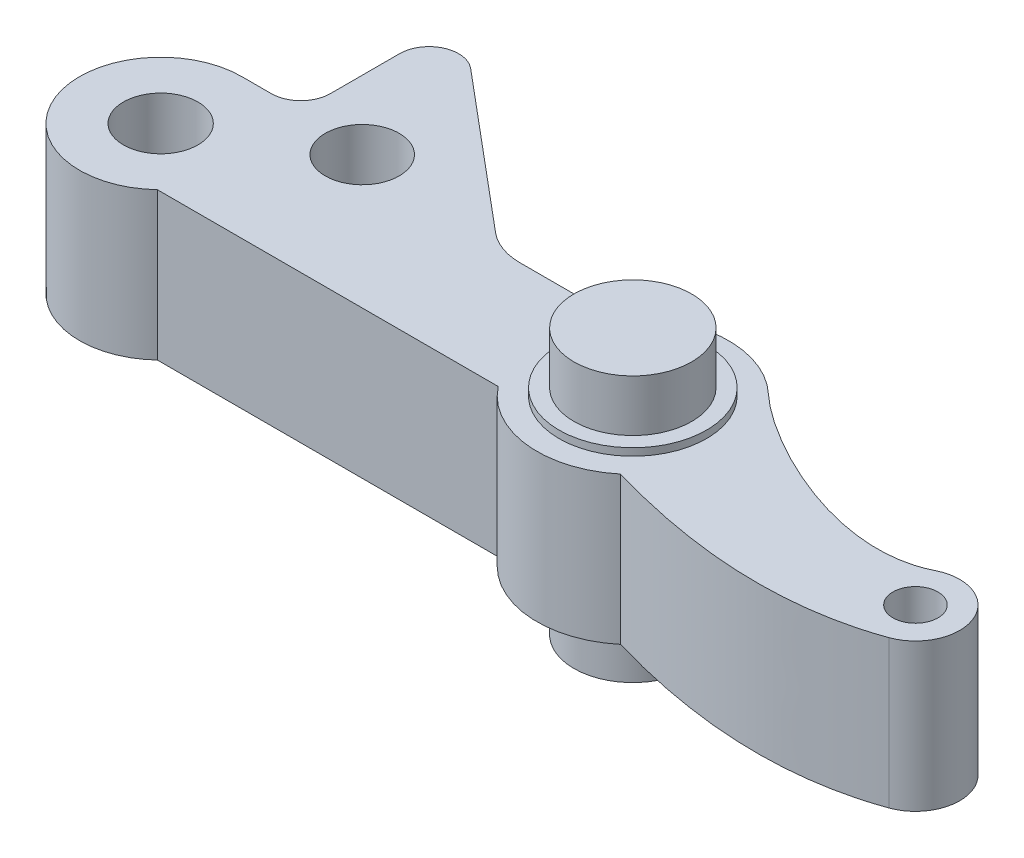
ISO-10303-21;
HEADER;
FILE_DESCRIPTION(('STEP AP214'),'2;1');
FILE_NAME('part.step','',(''),(''),'','','');
FILE_SCHEMA(('AUTOMOTIVE_DESIGN { 1 0 10303 214 1 1 1 1 }'));
ENDSEC;
DATA;
#1=APPLICATION_CONTEXT('core data for automotive mechanical design processes');
#2=APPLICATION_PROTOCOL_DEFINITION('international standard','automotive_design',2000,#1);
#3=PRODUCT_CONTEXT('',#1,'mechanical');
#4=PRODUCT('Part','Part','',(#3));
#5=PRODUCT_RELATED_PRODUCT_CATEGORY('part','',(#4));
#6=PRODUCT_DEFINITION_FORMATION('','',#4);
#7=PRODUCT_DEFINITION_CONTEXT('part definition',#1,'design');
#8=PRODUCT_DEFINITION('design','',#6,#7);
#9=PRODUCT_DEFINITION_SHAPE('','',#8);
#10=(LENGTH_UNIT() NAMED_UNIT(*) SI_UNIT(.MILLI.,.METRE.));
#11=(NAMED_UNIT(*) PLANE_ANGLE_UNIT() SI_UNIT($,.RADIAN.));
#12=(NAMED_UNIT(*) SI_UNIT($,.STERADIAN.) SOLID_ANGLE_UNIT());
#13=UNCERTAINTY_MEASURE_WITH_UNIT(LENGTH_MEASURE(1.E-05),#10,'distance_accuracy_value','');
#14=(GEOMETRIC_REPRESENTATION_CONTEXT(3) GLOBAL_UNCERTAINTY_ASSIGNED_CONTEXT((#13)) GLOBAL_UNIT_ASSIGNED_CONTEXT((#10,
#11,#12)) REPRESENTATION_CONTEXT('',''));
#15=CARTESIAN_POINT('',(0.,0.,0.));
#16=DIRECTION('',(0.,0.,1.));
#17=DIRECTION('',(1.,0.,0.));
#18=AXIS2_PLACEMENT_3D('',#15,#16,#17);
#19=CARTESIAN_POINT('',(0.,10.,0.));
#20=DIRECTION('',(0.,-1.,0.));
#21=DIRECTION('',(0.,0.,-1.));
#22=AXIS2_PLACEMENT_3D('',#19,#20,#21);
#23=CYLINDRICAL_SURFACE('',#22,6.5);
#24=DIRECTION('',(0.,-1.,0.));
#25=VECTOR('',#24,1.);
#26=CARTESIAN_POINT('',(4.15942052119721,10.,4.9949195116483));
#27=LINE('',#26,#25);
#28=CARTESIAN_POINT('',(4.15942052119714,10.,4.99491951164822));
#29=VERTEX_POINT('',#28);
#30=CARTESIAN_POINT('',(4.15942052119714,0.,4.99491951164822));
#31=VERTEX_POINT('',#30);
#32=EDGE_CURVE('E258',#29,#31,#27,.T.);
#33=ORIENTED_EDGE('',*,*,#32,.F.);
#34=CARTESIAN_POINT('',(0.,10.,0.));
#35=DIRECTION('',(0.,1.,0.));
#36=DIRECTION('',(0.,0.,1.));
#37=AXIS2_PLACEMENT_3D('',#34,#35,#36);
#38=CIRCLE('',#37,6.5);
#39=CARTESIAN_POINT('',(-5.1234753829798,10.,4.));
#40=VERTEX_POINT('',#39);
#41=EDGE_CURVE('E260',#40,#29,#38,.T.);
#42=ORIENTED_EDGE('',*,*,#41,.F.);
#43=DIRECTION('',(0.,-1.,0.));
#44=VECTOR('',#43,1.);
#45=CARTESIAN_POINT('',(-5.1234753829798,10.,4.));
#46=LINE('',#45,#44);
#47=CARTESIAN_POINT('',(-5.1234753829798,0.,4.));
#48=VERTEX_POINT('',#47);
#49=EDGE_CURVE('E375',#40,#48,#46,.T.);
#50=ORIENTED_EDGE('',*,*,#49,.T.);
#51=CARTESIAN_POINT('',(0.,0.,0.));
#52=DIRECTION('',(0.,1.,0.));
#53=DIRECTION('',(0.,0.,1.));
#54=AXIS2_PLACEMENT_3D('',#51,#52,#53);
#55=CIRCLE('',#54,6.5);
#56=EDGE_CURVE('E262',#48,#31,#55,.T.);
#57=ORIENTED_EDGE('',*,*,#56,.T.);
#58=EDGE_LOOP('',(#33,#42,#50,#57));
#59=FACE_BOUND('',#58,.T.);
#60=ADVANCED_FACE('F45',(#59),#23,.T.);
#61=CARTESIAN_POINT('',(0.,10.,0.));
#62=DIRECTION('',(0.,1.,0.));
#63=DIRECTION('',(0.,0.,1.));
#64=AXIS2_PLACEMENT_3D('',#61,#62,#63);
#65=PLANE('',#64);
#66=CARTESIAN_POINT('',(0.,10.,0.));
#67=DIRECTION('',(0.,1.,0.));
#68=DIRECTION('',(0.,0.,1.));
#69=AXIS2_PLACEMENT_3D('',#66,#67,#68);
#70=CIRCLE('',#69,5.);
#71=CARTESIAN_POINT('',(0.,10.,5.));
#72=VERTEX_POINT('',#71);
#73=EDGE_CURVE('E324',#72,#72,#70,.T.);
#74=ORIENTED_EDGE('',*,*,#73,.F.);
#75=EDGE_LOOP('',(#74));
#76=FACE_BOUND('',#75,.T.);
#77=CARTESIAN_POINT('',(-32.,10.,0.));
#78=DIRECTION('',(0.,1.,0.));
#79=DIRECTION('',(0.,0.,1.));
#80=AXIS2_PLACEMENT_3D('',#77,#78,#79);
#81=CIRCLE('',#80,2.525);
#82=CARTESIAN_POINT('',(-32.,10.,2.525));
#83=VERTEX_POINT('',#82);
#84=EDGE_CURVE('E407',#83,#83,#81,.T.);
#85=ORIENTED_EDGE('',*,*,#84,.F.);
#86=EDGE_LOOP('',(#85));
#87=FACE_BOUND('',#86,.T.);
#88=DIRECTION('',(-0.766044443118977,0.,-0.64278760968654));
#89=VECTOR('',#88,1.);
#90=CARTESIAN_POINT('',(-13.1234753829798,10.,-4.));
#91=LINE('',#90,#89);
#92=CARTESIAN_POINT('',(-14.2387448846612,10.,-4.93582222752409));
#93=VERTEX_POINT('',#92);
#94=CARTESIAN_POINT('',(-24.7144247806269,10.,-13.7259613645602));
#95=VERTEX_POINT('',#94);
#96=EDGE_CURVE('E400',#93,#95,#91,.T.);
#97=ORIENTED_EDGE('',*,*,#96,.T.);
#98=CARTESIAN_POINT('',(-26.,10.,-12.1938724783223));
#99=DIRECTION('',(0.,1.,0.));
#100=DIRECTION('',(0.,0.,1.));
#101=AXIS2_PLACEMENT_3D('',#98,#99,#100);
#102=CIRCLE('',#101,2.);
#103=CARTESIAN_POINT('',(-28.,10.,-12.1938724783223));
#104=VERTEX_POINT('',#103);
#105=EDGE_CURVE('E348',#95,#104,#102,.T.);
#106=ORIENTED_EDGE('',*,*,#105,.T.);
#107=DIRECTION('',(0.,0.,1.));
#108=VECTOR('',#107,1.);
#109=CARTESIAN_POINT('',(-28.,10.,-16.4828863193414));
#110=LINE('',#109,#108);
#111=CARTESIAN_POINT('',(-28.,10.,-7.5));
#112=VERTEX_POINT('',#111);
#113=EDGE_CURVE('E398',#104,#112,#110,.T.);
#114=ORIENTED_EDGE('',*,*,#113,.T.);
#115=CARTESIAN_POINT('',(-30.,10.,-7.5));
#116=DIRECTION('',(0.,1.,0.));
#117=DIRECTION('',(0.,0.,1.));
#118=AXIS2_PLACEMENT_3D('',#115,#116,#117);
#119=CIRCLE('',#118,2.);
#120=CARTESIAN_POINT('',(-30.,10.,-5.5));
#121=VERTEX_POINT('',#120);
#122=EDGE_CURVE('E11',#112,#121,#119,.F.);
#123=ORIENTED_EDGE('',*,*,#122,.T.);
#124=DIRECTION('',(-1.,0.,0.));
#125=VECTOR('',#124,1.);
#126=CARTESIAN_POINT('',(-32.,10.,-5.5));
#127=LINE('',#126,#125);
#128=CARTESIAN_POINT('',(-32.,10.,-5.5));
#129=VERTEX_POINT('',#128);
#130=EDGE_CURVE('E396',#121,#129,#127,.T.);
#131=ORIENTED_EDGE('',*,*,#130,.T.);
#132=CARTESIAN_POINT('',(-32.,10.,0.));
#133=DIRECTION('',(0.,1.,0.));
#134=DIRECTION('',(0.,0.,1.));
#135=AXIS2_PLACEMENT_3D('',#132,#133,#134);
#136=CIRCLE('',#135,5.5);
#137=CARTESIAN_POINT('',(-28.2250827823646,10.,4.));
#138=VERTEX_POINT('',#137);
#139=EDGE_CURVE('E394',#129,#138,#136,.T.);
#140=ORIENTED_EDGE('',*,*,#139,.T.);
#141=DIRECTION('',(1.,0.,0.));
#142=VECTOR('',#141,1.);
#143=CARTESIAN_POINT('',(-5.1234753829798,10.,4.));
#144=LINE('',#143,#142);
#145=EDGE_CURVE('E269',#138,#40,#144,.T.);
#146=ORIENTED_EDGE('',*,*,#145,.T.);
#147=ORIENTED_EDGE('',*,*,#41,.T.);
#148=CARTESIAN_POINT('',(4.15942052119714,10.,4.99491951164822));
#149=CARTESIAN_POINT('',(15.250954870233,10.,8.23257274190577));
#150=CARTESIAN_POINT('',(22.8496559981527,10.,5.50469290991856));
#151=B_SPLINE_CURVE_WITH_KNOTS('',2,(#148,#149,#150),.UNSPECIFIED.,.F.,.F.,(3,3),(0.,1.),.UNSPECIFIED.);
#152=CARTESIAN_POINT('',(22.8496559981527,10.,5.50469290991856));
#153=VERTEX_POINT('',#152);
#154=EDGE_CURVE('E157',#29,#153,#151,.T.);
#155=ORIENTED_EDGE('',*,*,#154,.T.);
#156=CARTESIAN_POINT('',(21.8360153361091,10.,2.68112555491325));
#157=DIRECTION('',(0.,-1.,0.));
#158=DIRECTION('',(0.,0.,-1.));
#159=AXIS2_PLACEMENT_3D('',#156,#157,#158);
#160=CIRCLE('',#159,3.);
#161=CARTESIAN_POINT('',(20.4900711475221,10.,0.));
#162=VERTEX_POINT('',#161);
#163=EDGE_CURVE('E148',#153,#162,#160,.F.);
#164=ORIENTED_EDGE('',*,*,#163,.T.);
#165=CARTESIAN_POINT('',(4.46665949633744,10.,-4.722176716704));
#166=CARTESIAN_POINT('',(7.28486409440791,10.,-2.05646531160841));
#167=CARTESIAN_POINT('',(15.7167376008388,10.,2.39624755191802));
#168=CARTESIAN_POINT('',(20.4900711475221,10.,0.));
#169=B_SPLINE_CURVE_WITH_KNOTS('',3,(#165,#166,#167,#168),.UNSPECIFIED.,.F.,.F.,(4,4),(0.,1.),.UNSPECIFIED.);
#170=CARTESIAN_POINT('',(4.46665949633729,10.,-4.72217671670385));
#171=VERTEX_POINT('',#170);
#172=EDGE_CURVE('E154',#171,#162,#169,.T.);
#173=ORIENTED_EDGE('',*,*,#172,.F.);
#174=CARTESIAN_POINT('',(-5.1234753829798,10.,-4.));
#175=VERTEX_POINT('',#174);
#176=EDGE_CURVE('E272',#171,#175,#38,.T.);
#177=ORIENTED_EDGE('',*,*,#176,.T.);
#178=DIRECTION('',(-1.,0.,0.));
#179=VECTOR('',#178,1.);
#180=CARTESIAN_POINT('',(-5.1234753829798,10.,-4.));
#181=LINE('',#180,#179);
#182=CARTESIAN_POINT('',(-11.667594445915,10.,-4.));
#183=VERTEX_POINT('',#182);
#184=EDGE_CURVE('E271',#175,#183,#181,.T.);
#185=ORIENTED_EDGE('',*,*,#184,.T.);
#186=CARTESIAN_POINT('',(-11.667594445915,10.,-8.));
#187=DIRECTION('',(0.,1.,0.));
#188=DIRECTION('',(0.,0.,1.));
#189=AXIS2_PLACEMENT_3D('',#186,#187,#188);
#190=CIRCLE('',#189,4.);
#191=EDGE_CURVE('E357',#183,#93,#190,.F.);
#192=ORIENTED_EDGE('',*,*,#191,.T.);
#193=EDGE_LOOP('',(#97,#106,#114,#123,#131,#140,#146,#147,#155,#164,#173,#177,#185,#192));
#194=FACE_BOUND('',#193,.T.);
#195=CARTESIAN_POINT('',(-23.3397459621556,10.,-5.00000000000001));
#196=DIRECTION('',(0.,1.,0.));
#197=DIRECTION('',(0.,0.,1.));
#198=AXIS2_PLACEMENT_3D('',#195,#196,#197);
#199=CIRCLE('',#198,2.505);
#200=CARTESIAN_POINT('',(-23.3397459621556,10.,-2.49500000000001));
#201=VERTEX_POINT('',#200);
#202=EDGE_CURVE('E408',#201,#201,#199,.T.);
#203=ORIENTED_EDGE('',*,*,#202,.F.);
#204=EDGE_LOOP('',(#203));
#205=FACE_BOUND('',#204,.T.);
#206=CARTESIAN_POINT('',(21.8360153361091,10.,2.68112555491325));
#207=DIRECTION('',(0.,-1.,0.));
#208=DIRECTION('',(0.,0.,-1.));
#209=AXIS2_PLACEMENT_3D('',#206,#207,#208);
#210=CIRCLE('',#209,1.525);
#211=CARTESIAN_POINT('',(21.8360153361091,10.,1.15612555491325));
#212=VERTEX_POINT('',#211);
#213=EDGE_CURVE('E175',#212,#212,#210,.F.);
#214=ORIENTED_EDGE('',*,*,#213,.F.);
#215=EDGE_LOOP('',(#214));
#216=FACE_BOUND('',#215,.T.);
#217=ADVANCED_FACE('F151',(#76,#87,#194,#205,#216),#65,.T.);
#218=CARTESIAN_POINT('',(0.,0.,0.));
#219=DIRECTION('',(0.,1.,0.));
#220=DIRECTION('',(0.,0.,1.));
#221=AXIS2_PLACEMENT_3D('',#218,#219,#220);
#222=PLANE('',#221);
#223=CARTESIAN_POINT('',(0.,0.,0.));
#224=DIRECTION('',(0.,1.,0.));
#225=DIRECTION('',(0.,0.,1.));
#226=AXIS2_PLACEMENT_3D('',#223,#224,#225);
#227=CIRCLE('',#226,5.);
#228=CARTESIAN_POINT('',(0.,0.,5.));
#229=VERTEX_POINT('',#228);
#230=EDGE_CURVE('E322',#229,#229,#227,.T.);
#231=ORIENTED_EDGE('',*,*,#230,.T.);
#232=EDGE_LOOP('',(#231));
#233=FACE_BOUND('',#232,.T.);
#234=DIRECTION('',(0.,0.,1.));
#235=VECTOR('',#234,1.);
#236=CARTESIAN_POINT('',(-28.,0.,-16.4828863193414));
#237=LINE('',#236,#235);
#238=CARTESIAN_POINT('',(-28.,0.,-12.1938724783223));
#239=VERTEX_POINT('',#238);
#240=CARTESIAN_POINT('',(-28.,0.,-7.5));
#241=VERTEX_POINT('',#240);
#242=EDGE_CURVE('E383',#239,#241,#237,.T.);
#243=ORIENTED_EDGE('',*,*,#242,.F.);
#244=CARTESIAN_POINT('',(-26.,0.,-12.1938724783223));
#245=DIRECTION('',(0.,1.,0.));
#246=DIRECTION('',(0.,0.,1.));
#247=AXIS2_PLACEMENT_3D('',#244,#245,#246);
#248=CIRCLE('',#247,2.);
#249=CARTESIAN_POINT('',(-24.7144247806269,0.,-13.7259613645602));
#250=VERTEX_POINT('',#249);
#251=EDGE_CURVE('E352',#239,#250,#248,.F.);
#252=ORIENTED_EDGE('',*,*,#251,.T.);
#253=DIRECTION('',(-0.766044443118977,0.,-0.64278760968654));
#254=VECTOR('',#253,1.);
#255=CARTESIAN_POINT('',(-13.1234753829798,0.,-4.));
#256=LINE('',#255,#254);
#257=CARTESIAN_POINT('',(-14.2387448846612,0.,-4.93582222752409));
#258=VERTEX_POINT('',#257);
#259=EDGE_CURVE('E385',#258,#250,#256,.T.);
#260=ORIENTED_EDGE('',*,*,#259,.F.);
#261=CARTESIAN_POINT('',(-11.667594445915,0.,-8.));
#262=DIRECTION('',(0.,1.,0.));
#263=DIRECTION('',(0.,0.,1.));
#264=AXIS2_PLACEMENT_3D('',#261,#262,#263);
#265=CIRCLE('',#264,4.);
#266=CARTESIAN_POINT('',(-11.667594445915,0.,-4.));
#267=VERTEX_POINT('',#266);
#268=EDGE_CURVE('E359',#258,#267,#265,.T.);
#269=ORIENTED_EDGE('',*,*,#268,.T.);
#270=DIRECTION('',(-1.,0.,0.));
#271=VECTOR('',#270,1.);
#272=CARTESIAN_POINT('',(-5.1234753829798,0.,-4.));
#273=LINE('',#272,#271);
#274=CARTESIAN_POINT('',(-5.1234753829798,0.,-4.));
#275=VERTEX_POINT('',#274);
#276=EDGE_CURVE('E388',#275,#267,#273,.T.);
#277=ORIENTED_EDGE('',*,*,#276,.F.);
#278=CARTESIAN_POINT('',(4.46665949633736,0.,-4.72217671670392));
#279=VERTEX_POINT('',#278);
#280=EDGE_CURVE('E392',#279,#275,#55,.T.);
#281=ORIENTED_EDGE('',*,*,#280,.F.);
#282=CARTESIAN_POINT('',(4.46665949633744,0.,-4.722176716704));
#283=CARTESIAN_POINT('',(7.28486409440791,0.,-2.05646531160841));
#284=CARTESIAN_POINT('',(15.7167376008388,0.,2.39624755191802));
#285=CARTESIAN_POINT('',(20.4900711475221,0.,0.));
#286=B_SPLINE_CURVE_WITH_KNOTS('',3,(#282,#283,#284,#285),.UNSPECIFIED.,.F.,.F.,(4,4),(0.,1.),.UNSPECIFIED.);
#287=CARTESIAN_POINT('',(20.4900711475221,0.,0.));
#288=VERTEX_POINT('',#287);
#289=EDGE_CURVE('E422',#279,#288,#286,.T.);
#290=ORIENTED_EDGE('',*,*,#289,.T.);
#291=CARTESIAN_POINT('',(21.8360153361091,0.,2.68112555491325));
#292=DIRECTION('',(0.,-1.,0.));
#293=DIRECTION('',(0.,0.,-1.));
#294=AXIS2_PLACEMENT_3D('',#291,#292,#293);
#295=CIRCLE('',#294,3.);
#296=CARTESIAN_POINT('',(22.8496559981527,0.,5.50469290991856));
#297=VERTEX_POINT('',#296);
#298=EDGE_CURVE('E165',#297,#288,#295,.F.);
#299=ORIENTED_EDGE('',*,*,#298,.F.);
#300=CARTESIAN_POINT('',(4.15942052119714,0.,4.99491951164822));
#301=CARTESIAN_POINT('',(15.250954870233,0.,8.23257274190577));
#302=CARTESIAN_POINT('',(22.8496559981527,0.,5.50469290991856));
#303=B_SPLINE_CURVE_WITH_KNOTS('',2,(#300,#301,#302),.UNSPECIFIED.,.F.,.F.,(3,3),(0.,1.),.UNSPECIFIED.);
#304=EDGE_CURVE('E178',#31,#297,#303,.T.);
#305=ORIENTED_EDGE('',*,*,#304,.F.);
#306=ORIENTED_EDGE('',*,*,#56,.F.);
#307=DIRECTION('',(1.,0.,0.));
#308=VECTOR('',#307,1.);
#309=CARTESIAN_POINT('',(-5.1234753829798,0.,4.));
#310=LINE('',#309,#308);
#311=CARTESIAN_POINT('',(-28.2250827823646,0.,4.));
#312=VERTEX_POINT('',#311);
#313=EDGE_CURVE('E377',#312,#48,#310,.T.);
#314=ORIENTED_EDGE('',*,*,#313,.F.);
#315=CARTESIAN_POINT('',(-32.,0.,0.));
#316=DIRECTION('',(0.,1.,0.));
#317=DIRECTION('',(0.,0.,1.));
#318=AXIS2_PLACEMENT_3D('',#315,#316,#317);
#319=CIRCLE('',#318,5.5);
#320=CARTESIAN_POINT('',(-32.,0.,-5.5));
#321=VERTEX_POINT('',#320);
#322=EDGE_CURVE('E379',#321,#312,#319,.T.);
#323=ORIENTED_EDGE('',*,*,#322,.F.);
#324=DIRECTION('',(-1.,0.,0.));
#325=VECTOR('',#324,1.);
#326=CARTESIAN_POINT('',(-32.,0.,-5.5));
#327=LINE('',#326,#325);
#328=CARTESIAN_POINT('',(-30.,0.,-5.5));
#329=VERTEX_POINT('',#328);
#330=EDGE_CURVE('E381',#329,#321,#327,.T.);
#331=ORIENTED_EDGE('',*,*,#330,.F.);
#332=CARTESIAN_POINT('',(-30.,0.,-7.5));
#333=DIRECTION('',(0.,1.,0.));
#334=DIRECTION('',(0.,0.,1.));
#335=AXIS2_PLACEMENT_3D('',#332,#333,#334);
#336=CIRCLE('',#335,2.);
#337=EDGE_CURVE('E54',#329,#241,#336,.T.);
#338=ORIENTED_EDGE('',*,*,#337,.T.);
#339=EDGE_LOOP('',(#243,#252,#260,#269,#277,#281,#290,#299,#305,#306,#314,#323,#331,#338));
#340=FACE_BOUND('',#339,.T.);
#341=CARTESIAN_POINT('',(-32.,0.,0.));
#342=DIRECTION('',(0.,1.,0.));
#343=DIRECTION('',(0.,0.,1.));
#344=AXIS2_PLACEMENT_3D('',#341,#342,#343);
#345=CIRCLE('',#344,2.525);
#346=CARTESIAN_POINT('',(-32.,0.,2.525));
#347=VERTEX_POINT('',#346);
#348=EDGE_CURVE('E404',#347,#347,#345,.T.);
#349=ORIENTED_EDGE('',*,*,#348,.T.);
#350=EDGE_LOOP('',(#349));
#351=FACE_BOUND('',#350,.T.);
#352=CARTESIAN_POINT('',(-23.3397459621556,0.,-5.00000000000001));
#353=DIRECTION('',(0.,1.,0.));
#354=DIRECTION('',(0.,0.,1.));
#355=AXIS2_PLACEMENT_3D('',#352,#353,#354);
#356=CIRCLE('',#355,2.505);
#357=CARTESIAN_POINT('',(-23.3397459621556,0.,-2.49500000000001));
#358=VERTEX_POINT('',#357);
#359=EDGE_CURVE('E266',#358,#358,#356,.T.);
#360=ORIENTED_EDGE('',*,*,#359,.T.);
#361=EDGE_LOOP('',(#360));
#362=FACE_BOUND('',#361,.T.);
#363=CARTESIAN_POINT('',(21.8360153361091,0.,2.68112555491325));
#364=DIRECTION('',(0.,-1.,0.));
#365=DIRECTION('',(0.,0.,-1.));
#366=AXIS2_PLACEMENT_3D('',#363,#364,#365);
#367=CIRCLE('',#366,1.525);
#368=CARTESIAN_POINT('',(21.8360153361091,0.,1.15612555491325));
#369=VERTEX_POINT('',#368);
#370=EDGE_CURVE('E279',#369,#369,#367,.F.);
#371=ORIENTED_EDGE('',*,*,#370,.T.);
#372=EDGE_LOOP('',(#371));
#373=FACE_BOUND('',#372,.T.);
#374=ADVANCED_FACE('F210',(#233,#340,#351,#362,#373),#222,.F.);
#375=ORIENTED_EDGE('',*,*,#176,.F.);
#376=DIRECTION('',(0.,-1.,0.));
#377=VECTOR('',#376,1.);
#378=CARTESIAN_POINT('',(4.46665949633736,10.,-4.72217671670392));
#379=LINE('',#378,#377);
#380=EDGE_CURVE('E170',#171,#279,#379,.T.);
#381=ORIENTED_EDGE('',*,*,#380,.T.);
#382=ORIENTED_EDGE('',*,*,#280,.T.);
#383=DIRECTION('',(0.,-1.,0.));
#384=VECTOR('',#383,1.);
#385=CARTESIAN_POINT('',(-5.1234753829798,10.,-4.));
#386=LINE('',#385,#384);
#387=EDGE_CURVE('E366',#175,#275,#386,.T.);
#388=ORIENTED_EDGE('',*,*,#387,.F.);
#389=EDGE_LOOP('',(#375,#381,#382,#388));
#390=FACE_BOUND('',#389,.T.);
#391=ADVANCED_FACE('F214',(#390),#23,.T.);
#392=CARTESIAN_POINT('',(-5.1234753829798,10.,-4.));
#393=DIRECTION('',(0.,0.,1.));
#394=DIRECTION('',(1.,0.,0.));
#395=AXIS2_PLACEMENT_3D('',#392,#393,#394);
#396=PLANE('',#395);
#397=ORIENTED_EDGE('',*,*,#276,.T.);
#398=DIRECTION('',(0.,-1.,0.));
#399=VECTOR('',#398,1.);
#400=CARTESIAN_POINT('',(-11.667594445915,10.,-4.));
#401=LINE('',#400,#399);
#402=EDGE_CURVE('E361',#267,#183,#401,.F.);
#403=ORIENTED_EDGE('',*,*,#402,.T.);
#404=ORIENTED_EDGE('',*,*,#184,.F.);
#405=ORIENTED_EDGE('',*,*,#387,.T.);
#406=EDGE_LOOP('',(#397,#403,#404,#405));
#407=FACE_BOUND('',#406,.T.);
#408=ADVANCED_FACE('F233',(#407),#396,.F.);
#409=CARTESIAN_POINT('',(-13.1234753829798,10.,-4.));
#410=DIRECTION('',(-0.64278760968654,0.,0.766044443118977));
#411=DIRECTION('',(0.766044443118977,0.,0.64278760968654));
#412=AXIS2_PLACEMENT_3D('',#409,#410,#411);
#413=PLANE('',#412);
#414=ORIENTED_EDGE('',*,*,#259,.T.);
#415=DIRECTION('',(0.,-1.,0.));
#416=VECTOR('',#415,1.);
#417=CARTESIAN_POINT('',(-24.7144247806269,10.,-13.7259613645602));
#418=LINE('',#417,#416);
#419=EDGE_CURVE('E350',#250,#95,#418,.F.);
#420=ORIENTED_EDGE('',*,*,#419,.T.);
#421=ORIENTED_EDGE('',*,*,#96,.F.);
#422=DIRECTION('',(0.,-1.,0.));
#423=VECTOR('',#422,1.);
#424=CARTESIAN_POINT('',(-14.2387448846612,0.,-4.93582222752409));
#425=LINE('',#424,#423);
#426=EDGE_CURVE('E363',#93,#258,#425,.T.);
#427=ORIENTED_EDGE('',*,*,#426,.T.);
#428=EDGE_LOOP('',(#414,#420,#421,#427));
#429=FACE_BOUND('',#428,.T.);
#430=ADVANCED_FACE('F230',(#429),#413,.F.);
#431=CARTESIAN_POINT('',(-28.,10.,-16.4828863193414));
#432=DIRECTION('',(1.,0.,0.));
#433=DIRECTION('',(0.,0.,-1.));
#434=AXIS2_PLACEMENT_3D('',#431,#432,#433);
#435=PLANE('',#434);
#436=ORIENTED_EDGE('',*,*,#242,.T.);
#437=DIRECTION('',(0.,-1.,0.));
#438=VECTOR('',#437,1.);
#439=CARTESIAN_POINT('',(-28.,10.,-7.5));
#440=LINE('',#439,#438);
#441=EDGE_CURVE('E68',#241,#112,#440,.F.);
#442=ORIENTED_EDGE('',*,*,#441,.T.);
#443=ORIENTED_EDGE('',*,*,#113,.F.);
#444=DIRECTION('',(0.,-1.,0.));
#445=VECTOR('',#444,1.);
#446=CARTESIAN_POINT('',(-28.,10.,-12.1938724783223));
#447=LINE('',#446,#445);
#448=EDGE_CURVE('E354',#104,#239,#447,.T.);
#449=ORIENTED_EDGE('',*,*,#448,.T.);
#450=EDGE_LOOP('',(#436,#442,#443,#449));
#451=FACE_BOUND('',#450,.T.);
#452=ADVANCED_FACE('F226',(#451),#435,.F.);
#453=CARTESIAN_POINT('',(-32.,10.,-5.5));
#454=DIRECTION('',(0.,0.,1.));
#455=DIRECTION('',(1.,0.,0.));
#456=AXIS2_PLACEMENT_3D('',#453,#454,#455);
#457=PLANE('',#456);
#458=ORIENTED_EDGE('',*,*,#130,.F.);
#459=DIRECTION('',(0.,-1.,0.));
#460=VECTOR('',#459,1.);
#461=CARTESIAN_POINT('',(-30.,0.,-5.5));
#462=LINE('',#461,#460);
#463=EDGE_CURVE('E345',#121,#329,#462,.T.);
#464=ORIENTED_EDGE('',*,*,#463,.T.);
#465=ORIENTED_EDGE('',*,*,#330,.T.);
#466=DIRECTION('',(0.,-1.,0.));
#467=VECTOR('',#466,1.);
#468=CARTESIAN_POINT('',(-32.,10.,-5.5));
#469=LINE('',#468,#467);
#470=EDGE_CURVE('E369',#129,#321,#469,.T.);
#471=ORIENTED_EDGE('',*,*,#470,.F.);
#472=EDGE_LOOP('',(#458,#464,#465,#471));
#473=FACE_BOUND('',#472,.T.);
#474=ADVANCED_FACE('F222',(#473),#457,.F.);
#475=CARTESIAN_POINT('',(-32.,10.,0.));
#476=DIRECTION('',(0.,-1.,0.));
#477=DIRECTION('',(0.,0.,-1.));
#478=AXIS2_PLACEMENT_3D('',#475,#476,#477);
#479=CYLINDRICAL_SURFACE('',#478,5.5);
#480=ORIENTED_EDGE('',*,*,#322,.T.);
#481=DIRECTION('',(0.,-1.,0.));
#482=VECTOR('',#481,1.);
#483=CARTESIAN_POINT('',(-28.2250827823646,10.,4.));
#484=LINE('',#483,#482);
#485=EDGE_CURVE('E372',#138,#312,#484,.T.);
#486=ORIENTED_EDGE('',*,*,#485,.F.);
#487=ORIENTED_EDGE('',*,*,#139,.F.);
#488=ORIENTED_EDGE('',*,*,#470,.T.);
#489=EDGE_LOOP('',(#480,#486,#487,#488));
#490=FACE_BOUND('',#489,.T.);
#491=ADVANCED_FACE('F218',(#490),#479,.T.);
#492=CARTESIAN_POINT('',(-5.1234753829798,10.,4.));
#493=DIRECTION('',(0.,0.,-1.));
#494=DIRECTION('',(-1.,0.,0.));
#495=AXIS2_PLACEMENT_3D('',#492,#493,#494);
#496=PLANE('',#495);
#497=ORIENTED_EDGE('',*,*,#313,.T.);
#498=ORIENTED_EDGE('',*,*,#49,.F.);
#499=ORIENTED_EDGE('',*,*,#145,.F.);
#500=ORIENTED_EDGE('',*,*,#485,.T.);
#501=EDGE_LOOP('',(#497,#498,#499,#500));
#502=FACE_BOUND('',#501,.T.);
#503=ADVANCED_FACE('F206',(#502),#496,.F.);
#504=CARTESIAN_POINT('',(-32.,10.,0.));
#505=DIRECTION('',(0.,-1.,0.));
#506=DIRECTION('',(0.,0.,-1.));
#507=AXIS2_PLACEMENT_3D('',#504,#505,#506);
#508=CYLINDRICAL_SURFACE('',#507,2.525);
#509=ORIENTED_EDGE('',*,*,#84,.T.);
#510=EDGE_LOOP('',(#509));
#511=FACE_BOUND('',#510,.T.);
#512=ORIENTED_EDGE('',*,*,#348,.F.);
#513=EDGE_LOOP('',(#512));
#514=FACE_BOUND('',#513,.T.);
#515=ADVANCED_FACE('F202',(#511,#514),#508,.F.);
#516=CARTESIAN_POINT('',(-23.3397459621556,10.,-5.00000000000001));
#517=DIRECTION('',(0.,-1.,0.));
#518=DIRECTION('',(0.,0.,-1.));
#519=AXIS2_PLACEMENT_3D('',#516,#517,#518);
#520=CYLINDRICAL_SURFACE('',#519,2.505);
#521=ORIENTED_EDGE('',*,*,#202,.T.);
#522=EDGE_LOOP('',(#521));
#523=FACE_BOUND('',#522,.T.);
#524=ORIENTED_EDGE('',*,*,#359,.F.);
#525=EDGE_LOOP('',(#524));
#526=FACE_BOUND('',#525,.T.);
#527=ADVANCED_FACE('F198',(#523,#526),#520,.F.);
#528=DIRECTION('',(0.,-1.,0.));
#529=VECTOR('',#528,1.);
#530=SURFACE_OF_LINEAR_EXTRUSION('',#151,#529);
#531=ORIENTED_EDGE('',*,*,#304,.T.);
#532=DIRECTION('',(0.,-1.,0.));
#533=VECTOR('',#532,1.);
#534=CARTESIAN_POINT('',(22.8496559981527,10.,5.50469290991856));
#535=LINE('',#534,#533);
#536=EDGE_CURVE('E169',#153,#297,#535,.T.);
#537=ORIENTED_EDGE('',*,*,#536,.F.);
#538=ORIENTED_EDGE('',*,*,#154,.F.);
#539=ORIENTED_EDGE('',*,*,#32,.T.);
#540=EDGE_LOOP('',(#531,#537,#538,#539));
#541=FACE_BOUND('',#540,.T.);
#542=ADVANCED_FACE('F201',(#541),#530,.F.);
#543=CARTESIAN_POINT('',(21.8360153361091,10.,2.68112555491325));
#544=DIRECTION('',(0.,-1.,0.));
#545=DIRECTION('',(0.,0.,-1.));
#546=AXIS2_PLACEMENT_3D('',#543,#544,#545);
#547=CYLINDRICAL_SURFACE('',#546,3.);
#548=ORIENTED_EDGE('',*,*,#298,.T.);
#549=DIRECTION('',(0.,-1.,0.));
#550=VECTOR('',#549,1.);
#551=CARTESIAN_POINT('',(20.4900711475221,10.,0.));
#552=LINE('',#551,#550);
#553=EDGE_CURVE('E163',#162,#288,#552,.T.);
#554=ORIENTED_EDGE('',*,*,#553,.F.);
#555=ORIENTED_EDGE('',*,*,#163,.F.);
#556=ORIENTED_EDGE('',*,*,#536,.T.);
#557=EDGE_LOOP('',(#548,#554,#555,#556));
#558=FACE_BOUND('',#557,.T.);
#559=ADVANCED_FACE('F164',(#558),#547,.T.);
#560=CARTESIAN_POINT('',(21.8360153361091,10.,2.68112555491325));
#561=DIRECTION('',(0.,-1.,0.));
#562=DIRECTION('',(0.,0.,-1.));
#563=AXIS2_PLACEMENT_3D('',#560,#561,#562);
#564=CYLINDRICAL_SURFACE('',#563,1.525);
#565=ORIENTED_EDGE('',*,*,#213,.T.);
#566=EDGE_LOOP('',(#565));
#567=FACE_BOUND('',#566,.T.);
#568=ORIENTED_EDGE('',*,*,#370,.F.);
#569=EDGE_LOOP('',(#568));
#570=FACE_BOUND('',#569,.T.);
#571=ADVANCED_FACE('F193',(#567,#570),#564,.F.);
#572=DIRECTION('',(0.,-1.,0.));
#573=VECTOR('',#572,1.);
#574=SURFACE_OF_LINEAR_EXTRUSION('',#169,#573);
#575=ORIENTED_EDGE('',*,*,#289,.F.);
#576=ORIENTED_EDGE('',*,*,#380,.F.);
#577=ORIENTED_EDGE('',*,*,#172,.T.);
#578=ORIENTED_EDGE('',*,*,#553,.T.);
#579=EDGE_LOOP('',(#575,#576,#577,#578));
#580=FACE_BOUND('',#579,.T.);
#581=ADVANCED_FACE('F173',(#580),#574,.T.);
#582=CARTESIAN_POINT('',(-11.667594445915,10.,-8.));
#583=DIRECTION('',(0.,1.,0.));
#584=DIRECTION('',(0.,0.,1.));
#585=AXIS2_PLACEMENT_3D('',#582,#583,#584);
#586=CYLINDRICAL_SURFACE('',#585,4.);
#587=ORIENTED_EDGE('',*,*,#191,.F.);
#588=ORIENTED_EDGE('',*,*,#402,.F.);
#589=ORIENTED_EDGE('',*,*,#268,.F.);
#590=ORIENTED_EDGE('',*,*,#426,.F.);
#591=EDGE_LOOP('',(#587,#588,#589,#590));
#592=FACE_BOUND('',#591,.T.);
#593=ADVANCED_FACE('F192',(#592),#586,.F.);
#594=CARTESIAN_POINT('',(-26.,10.,-12.1938724783223));
#595=DIRECTION('',(0.,-1.,0.));
#596=DIRECTION('',(0.,0.,-1.));
#597=AXIS2_PLACEMENT_3D('',#594,#595,#596);
#598=CYLINDRICAL_SURFACE('',#597,2.);
#599=ORIENTED_EDGE('',*,*,#105,.F.);
#600=ORIENTED_EDGE('',*,*,#419,.F.);
#601=ORIENTED_EDGE('',*,*,#251,.F.);
#602=ORIENTED_EDGE('',*,*,#448,.F.);
#603=EDGE_LOOP('',(#599,#600,#601,#602));
#604=FACE_BOUND('',#603,.T.);
#605=ADVANCED_FACE('F242',(#604),#598,.T.);
#606=CARTESIAN_POINT('',(-30.,10.,-7.5));
#607=DIRECTION('',(0.,1.,0.));
#608=DIRECTION('',(0.,0.,1.));
#609=AXIS2_PLACEMENT_3D('',#606,#607,#608);
#610=CYLINDRICAL_SURFACE('',#609,2.);
#611=ORIENTED_EDGE('',*,*,#122,.F.);
#612=ORIENTED_EDGE('',*,*,#441,.F.);
#613=ORIENTED_EDGE('',*,*,#337,.F.);
#614=ORIENTED_EDGE('',*,*,#463,.F.);
#615=EDGE_LOOP('',(#611,#612,#613,#614));
#616=FACE_BOUND('',#615,.T.);
#617=ADVANCED_FACE('F47',(#616),#610,.F.);
#618=CARTESIAN_POINT('',(0.,10.5,0.));
#619=DIRECTION('',(0.,-1.,0.));
#620=DIRECTION('',(0.,0.,-1.));
#621=AXIS2_PLACEMENT_3D('',#618,#619,#620);
#622=CYLINDRICAL_SURFACE('',#621,5.);
#623=CARTESIAN_POINT('',(0.,10.5,0.));
#624=DIRECTION('',(0.,1.,0.));
#625=DIRECTION('',(0.,0.,1.));
#626=AXIS2_PLACEMENT_3D('',#623,#624,#625);
#627=CIRCLE('',#626,5.);
#628=CARTESIAN_POINT('',(0.,10.5,5.));
#629=VERTEX_POINT('',#628);
#630=EDGE_CURVE('E328',#629,#629,#627,.T.);
#631=ORIENTED_EDGE('',*,*,#630,.F.);
#632=EDGE_LOOP('',(#631));
#633=FACE_BOUND('',#632,.T.);
#634=ORIENTED_EDGE('',*,*,#73,.T.);
#635=EDGE_LOOP('',(#634));
#636=FACE_BOUND('',#635,.T.);
#637=ADVANCED_FACE('F249',(#633,#636),#622,.T.);
#638=CARTESIAN_POINT('',(0.,10.5,0.));
#639=DIRECTION('',(0.,1.,0.));
#640=DIRECTION('',(0.,0.,1.));
#641=AXIS2_PLACEMENT_3D('',#638,#639,#640);
#642=PLANE('',#641);
#643=CARTESIAN_POINT('',(0.,10.5,0.));
#644=DIRECTION('',(0.,1.,0.));
#645=DIRECTION('',(0.,0.,1.));
#646=AXIS2_PLACEMENT_3D('',#643,#644,#645);
#647=CIRCLE('',#646,3.99);
#648=CARTESIAN_POINT('',(0.,10.5,3.99));
#649=VERTEX_POINT('',#648);
#650=EDGE_CURVE('E331',#649,#649,#647,.T.);
#651=ORIENTED_EDGE('',*,*,#650,.F.);
#652=EDGE_LOOP('',(#651));
#653=FACE_BOUND('',#652,.T.);
#654=ORIENTED_EDGE('',*,*,#630,.T.);
#655=EDGE_LOOP('',(#654));
#656=FACE_BOUND('',#655,.T.);
#657=ADVANCED_FACE('F300',(#653,#656),#642,.T.);
#658=CARTESIAN_POINT('',(0.,14.,0.));
#659=DIRECTION('',(0.,1.,0.));
#660=DIRECTION('',(0.,0.,1.));
#661=AXIS2_PLACEMENT_3D('',#658,#659,#660);
#662=PLANE('',#661);
#663=CARTESIAN_POINT('',(0.,14.,0.));
#664=DIRECTION('',(0.,1.,0.));
#665=DIRECTION('',(0.,0.,1.));
#666=AXIS2_PLACEMENT_3D('',#663,#664,#665);
#667=CIRCLE('',#666,3.99);
#668=CARTESIAN_POINT('',(0.,14.,3.99));
#669=VERTEX_POINT('',#668);
#670=EDGE_CURVE('E334',#669,#669,#667,.T.);
#671=ORIENTED_EDGE('',*,*,#670,.T.);
#672=EDGE_LOOP('',(#671));
#673=FACE_BOUND('',#672,.T.);
#674=ADVANCED_FACE('F290',(#673),#662,.T.);
#675=CARTESIAN_POINT('',(0.,14.,0.));
#676=DIRECTION('',(0.,-1.,0.));
#677=DIRECTION('',(0.,0.,-1.));
#678=AXIS2_PLACEMENT_3D('',#675,#676,#677);
#679=CYLINDRICAL_SURFACE('',#678,3.99);
#680=ORIENTED_EDGE('',*,*,#650,.T.);
#681=EDGE_LOOP('',(#680));
#682=FACE_BOUND('',#681,.T.);
#683=ORIENTED_EDGE('',*,*,#670,.F.);
#684=EDGE_LOOP('',(#683));
#685=FACE_BOUND('',#684,.T.);
#686=ADVANCED_FACE('F286',(#682,#685),#679,.T.);
#687=CARTESIAN_POINT('',(0.,-0.5,0.));
#688=DIRECTION('',(0.,1.,0.));
#689=DIRECTION('',(0.,0.,1.));
#690=AXIS2_PLACEMENT_3D('',#687,#688,#689);
#691=CYLINDRICAL_SURFACE('',#690,5.);
#692=CARTESIAN_POINT('',(0.,-0.5,0.));
#693=DIRECTION('',(0.,1.,0.));
#694=DIRECTION('',(0.,0.,1.));
#695=AXIS2_PLACEMENT_3D('',#692,#693,#694);
#696=CIRCLE('',#695,5.);
#697=CARTESIAN_POINT('',(0.,-0.5,5.));
#698=VERTEX_POINT('',#697);
#699=EDGE_CURVE('E321',#698,#698,#696,.T.);
#700=ORIENTED_EDGE('',*,*,#699,.T.);
#701=EDGE_LOOP('',(#700));
#702=FACE_BOUND('',#701,.T.);
#703=ORIENTED_EDGE('',*,*,#230,.F.);
#704=EDGE_LOOP('',(#703));
#705=FACE_BOUND('',#704,.T.);
#706=ADVANCED_FACE('F289',(#702,#705),#691,.T.);
#707=CARTESIAN_POINT('',(0.,-0.5,0.));
#708=DIRECTION('',(0.,-1.,0.));
#709=DIRECTION('',(0.,0.,1.));
#710=AXIS2_PLACEMENT_3D('',#707,#708,#709);
#711=PLANE('',#710);
#712=CARTESIAN_POINT('',(0.,-0.5,0.));
#713=DIRECTION('',(0.,-1.,0.));
#714=DIRECTION('',(0.,0.,-1.));
#715=AXIS2_PLACEMENT_3D('',#712,#713,#714);
#716=CIRCLE('',#715,3.99);
#717=CARTESIAN_POINT('',(0.,-0.5,-3.99));
#718=VERTEX_POINT('',#717);
#719=EDGE_CURVE('E49',#718,#718,#716,.T.);
#720=ORIENTED_EDGE('',*,*,#719,.F.);
#721=EDGE_LOOP('',(#720));
#722=FACE_BOUND('',#721,.T.);
#723=ORIENTED_EDGE('',*,*,#699,.F.);
#724=EDGE_LOOP('',(#723));
#725=FACE_BOUND('',#724,.T.);
#726=ADVANCED_FACE('F296',(#722,#725),#711,.T.);
#727=CARTESIAN_POINT('',(0.,-4.,0.));
#728=DIRECTION('',(0.,1.,0.));
#729=DIRECTION('',(0.,0.,1.));
#730=AXIS2_PLACEMENT_3D('',#727,#728,#729);
#731=PLANE('',#730);
#732=CARTESIAN_POINT('',(0.,-4.,0.));
#733=DIRECTION('',(0.,1.,0.));
#734=DIRECTION('',(0.,0.,1.));
#735=AXIS2_PLACEMENT_3D('',#732,#733,#734);
#736=CIRCLE('',#735,3.99);
#737=CARTESIAN_POINT('',(0.,-4.,3.99));
#738=VERTEX_POINT('',#737);
#739=EDGE_CURVE('E336',#738,#738,#736,.T.);
#740=ORIENTED_EDGE('',*,*,#739,.F.);
#741=EDGE_LOOP('',(#740));
#742=FACE_BOUND('',#741,.T.);
#743=ADVANCED_FACE('F293',(#742),#731,.F.);
#744=ORIENTED_EDGE('',*,*,#719,.T.);
#745=EDGE_LOOP('',(#744));
#746=FACE_BOUND('',#745,.T.);
#747=ORIENTED_EDGE('',*,*,#739,.T.);
#748=EDGE_LOOP('',(#747));
#749=FACE_BOUND('',#748,.T.);
#750=ADVANCED_FACE('F292',(#746,#749),#679,.T.);
#751=CLOSED_SHELL('',(#60,#217,#374,#391,#408,#430,#452,#474,#491,#503,#515,#527,#542,#559,#571,
#581,#593,#605,#617,#637,#657,#674,#686,#706,#726,#743,#750));
#752=MANIFOLD_SOLID_BREP('B2',#751);
#753=ADVANCED_BREP_SHAPE_REPRESENTATION('',(#18,#752),#14);
#754=SHAPE_DEFINITION_REPRESENTATION(#9,#753);
ENDSEC;
END-ISO-10303-21;
